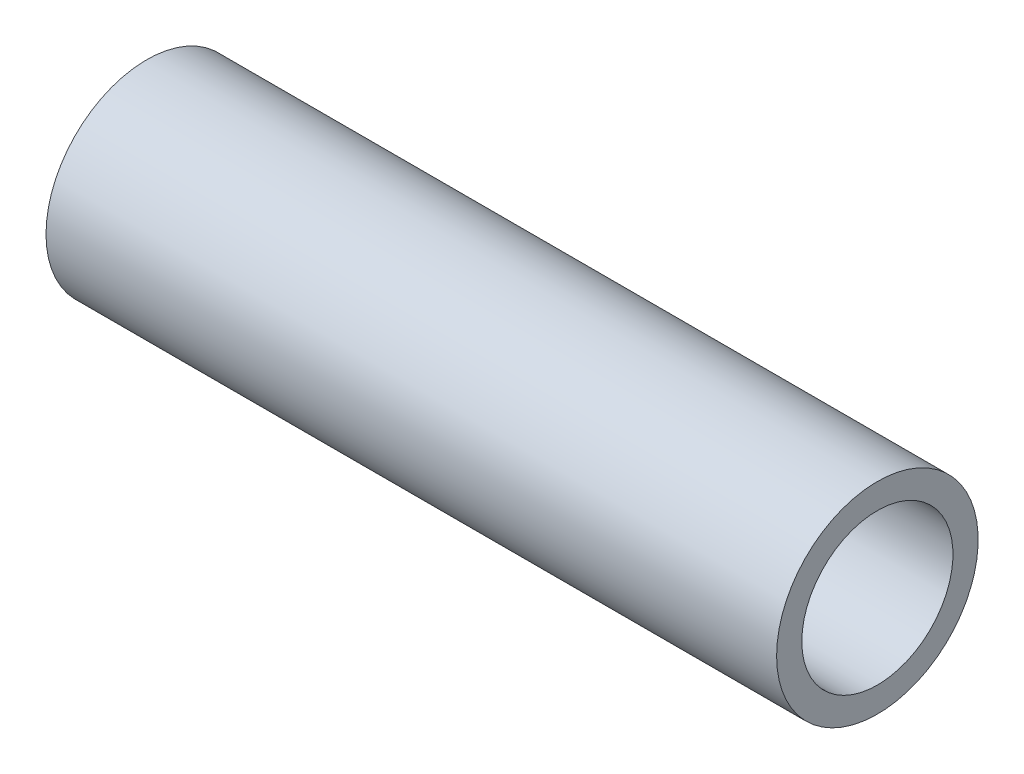
ISO-10303-21;
HEADER;
FILE_DESCRIPTION(('STEP AP214'),'2;1');
FILE_NAME('part.step','',(''),(''),'','','');
FILE_SCHEMA(('AUTOMOTIVE_DESIGN { 1 0 10303 214 1 1 1 1 }'));
ENDSEC;
DATA;
#1=APPLICATION_CONTEXT('core data for automotive mechanical design processes');
#2=APPLICATION_PROTOCOL_DEFINITION('international standard','automotive_design',2000,#1);
#3=PRODUCT_CONTEXT('',#1,'mechanical');
#4=PRODUCT('Part','Part','',(#3));
#5=PRODUCT_RELATED_PRODUCT_CATEGORY('part','',(#4));
#6=PRODUCT_DEFINITION_FORMATION('','',#4);
#7=PRODUCT_DEFINITION_CONTEXT('part definition',#1,'design');
#8=PRODUCT_DEFINITION('design','',#6,#7);
#9=PRODUCT_DEFINITION_SHAPE('','',#8);
#10=(LENGTH_UNIT() NAMED_UNIT(*) SI_UNIT(.MILLI.,.METRE.));
#11=(NAMED_UNIT(*) PLANE_ANGLE_UNIT() SI_UNIT($,.RADIAN.));
#12=(NAMED_UNIT(*) SI_UNIT($,.STERADIAN.) SOLID_ANGLE_UNIT());
#13=UNCERTAINTY_MEASURE_WITH_UNIT(LENGTH_MEASURE(1.E-05),#10,'distance_accuracy_value','');
#14=(GEOMETRIC_REPRESENTATION_CONTEXT(3) GLOBAL_UNCERTAINTY_ASSIGNED_CONTEXT((#13)) GLOBAL_UNIT_ASSIGNED_CONTEXT((#10,
#11,#12)) REPRESENTATION_CONTEXT('',''));
#15=CARTESIAN_POINT('',(0.,0.,0.));
#16=DIRECTION('',(0.,0.,1.));
#17=DIRECTION('',(1.,0.,0.));
#18=AXIS2_PLACEMENT_3D('',#15,#16,#17);
#19=CARTESIAN_POINT('',(167.,21.,40.));
#20=DIRECTION('',(-1.,0.,0.));
#21=DIRECTION('',(0.,0.,1.));
#22=AXIS2_PLACEMENT_3D('',#19,#20,#21);
#23=PLANE('',#22);
#24=CARTESIAN_POINT('',(167.,21.,40.));
#25=DIRECTION('',(-1.,0.,0.));
#26=DIRECTION('',(0.,0.,1.));
#27=AXIS2_PLACEMENT_3D('',#24,#25,#26);
#28=CIRCLE('',#27,3.);
#29=CARTESIAN_POINT('',(167.,21.,43.));
#30=VERTEX_POINT('',#29);
#31=EDGE_CURVE('E61',#30,#30,#28,.T.);
#32=ORIENTED_EDGE('',*,*,#31,.T.);
#33=EDGE_LOOP('',(#32));
#34=FACE_BOUND('',#33,.T.);
#35=CARTESIAN_POINT('',(167.,21.,40.));
#36=DIRECTION('',(-1.,0.,0.));
#37=DIRECTION('',(0.,0.,1.));
#38=AXIS2_PLACEMENT_3D('',#35,#36,#37);
#39=CIRCLE('',#38,4.);
#40=CARTESIAN_POINT('',(167.,21.,44.));
#41=VERTEX_POINT('',#40);
#42=EDGE_CURVE('E51',#41,#41,#39,.T.);
#43=ORIENTED_EDGE('',*,*,#42,.F.);
#44=EDGE_LOOP('',(#43));
#45=FACE_BOUND('',#44,.T.);
#46=ADVANCED_FACE('F50',(#34,#45),#23,.F.);
#47=CARTESIAN_POINT('',(138.,21.,40.));
#48=DIRECTION('',(-1.,0.,0.));
#49=DIRECTION('',(0.,0.,1.));
#50=AXIS2_PLACEMENT_3D('',#47,#48,#49);
#51=PLANE('',#50);
#52=CARTESIAN_POINT('',(138.,21.,40.));
#53=DIRECTION('',(-1.,0.,0.));
#54=DIRECTION('',(0.,0.,1.));
#55=AXIS2_PLACEMENT_3D('',#52,#53,#54);
#56=CIRCLE('',#55,3.);
#57=CARTESIAN_POINT('',(138.,21.,43.));
#58=VERTEX_POINT('',#57);
#59=EDGE_CURVE('E59',#58,#58,#56,.T.);
#60=ORIENTED_EDGE('',*,*,#59,.F.);
#61=EDGE_LOOP('',(#60));
#62=FACE_BOUND('',#61,.T.);
#63=CARTESIAN_POINT('',(138.,21.,40.));
#64=DIRECTION('',(-1.,0.,0.));
#65=DIRECTION('',(0.,0.,1.));
#66=AXIS2_PLACEMENT_3D('',#63,#64,#65);
#67=CIRCLE('',#66,4.);
#68=CARTESIAN_POINT('',(138.,21.,44.));
#69=VERTEX_POINT('',#68);
#70=EDGE_CURVE('E11',#69,#69,#67,.T.);
#71=ORIENTED_EDGE('',*,*,#70,.T.);
#72=EDGE_LOOP('',(#71));
#73=FACE_BOUND('',#72,.T.);
#74=ADVANCED_FACE('F73',(#62,#73),#51,.T.);
#75=CARTESIAN_POINT('',(167.,21.,40.));
#76=DIRECTION('',(-1.,0.,0.));
#77=DIRECTION('',(0.,0.,1.));
#78=AXIS2_PLACEMENT_3D('',#75,#76,#77);
#79=CYLINDRICAL_SURFACE('',#78,4.);
#80=ORIENTED_EDGE('',*,*,#70,.F.);
#81=EDGE_LOOP('',(#80));
#82=FACE_BOUND('',#81,.T.);
#83=ORIENTED_EDGE('',*,*,#42,.T.);
#84=EDGE_LOOP('',(#83));
#85=FACE_BOUND('',#84,.T.);
#86=ADVANCED_FACE('F47',(#82,#85),#79,.T.);
#87=CARTESIAN_POINT('',(167.,21.,40.));
#88=DIRECTION('',(-1.,0.,0.));
#89=DIRECTION('',(0.,0.,1.));
#90=AXIS2_PLACEMENT_3D('',#87,#88,#89);
#91=CYLINDRICAL_SURFACE('',#90,3.);
#92=ORIENTED_EDGE('',*,*,#59,.T.);
#93=EDGE_LOOP('',(#92));
#94=FACE_BOUND('',#93,.T.);
#95=ORIENTED_EDGE('',*,*,#31,.F.);
#96=EDGE_LOOP('',(#95));
#97=FACE_BOUND('',#96,.T.);
#98=ADVANCED_FACE('F67',(#94,#97),#91,.F.);
#99=CLOSED_SHELL('',(#46,#74,#86,#98));
#100=MANIFOLD_SOLID_BREP('B2',#99);
#101=ADVANCED_BREP_SHAPE_REPRESENTATION('',(#18,#100),#14);
#102=SHAPE_DEFINITION_REPRESENTATION(#9,#101);
ENDSEC;
END-ISO-10303-21;
